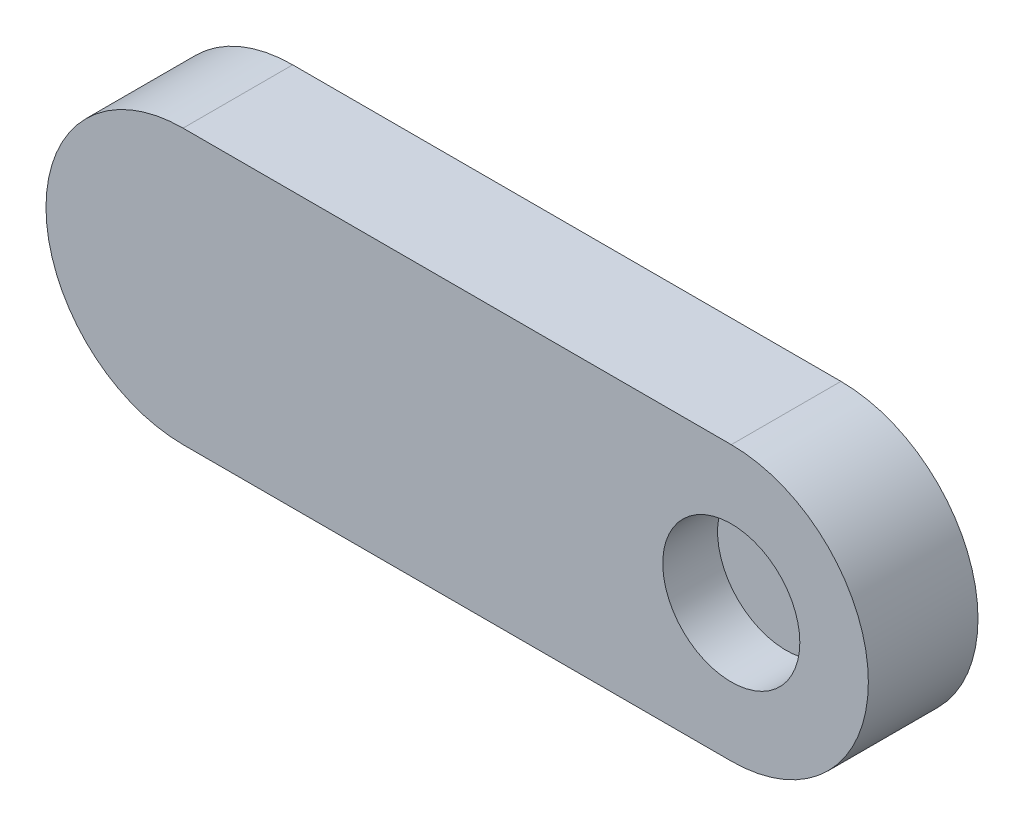
ISO-10303-21;
HEADER;
FILE_DESCRIPTION(('STEP AP214'),'2;1');
FILE_NAME('part.step','',(''),(''),'','','');
FILE_SCHEMA(('AUTOMOTIVE_DESIGN { 1 0 10303 214 1 1 1 1 }'));
ENDSEC;
DATA;
#1=APPLICATION_CONTEXT('core data for automotive mechanical design processes');
#2=APPLICATION_PROTOCOL_DEFINITION('international standard','automotive_design',2000,#1);
#3=PRODUCT_CONTEXT('',#1,'mechanical');
#4=PRODUCT('Part','Part','',(#3));
#5=PRODUCT_RELATED_PRODUCT_CATEGORY('part','',(#4));
#6=PRODUCT_DEFINITION_FORMATION('','',#4);
#7=PRODUCT_DEFINITION_CONTEXT('part definition',#1,'design');
#8=PRODUCT_DEFINITION('design','',#6,#7);
#9=PRODUCT_DEFINITION_SHAPE('','',#8);
#10=(LENGTH_UNIT() NAMED_UNIT(*) SI_UNIT(.MILLI.,.METRE.));
#11=(NAMED_UNIT(*) PLANE_ANGLE_UNIT() SI_UNIT($,.RADIAN.));
#12=(NAMED_UNIT(*) SI_UNIT($,.STERADIAN.) SOLID_ANGLE_UNIT());
#13=UNCERTAINTY_MEASURE_WITH_UNIT(LENGTH_MEASURE(1.E-05),#10,'distance_accuracy_value','');
#14=(GEOMETRIC_REPRESENTATION_CONTEXT(3) GLOBAL_UNCERTAINTY_ASSIGNED_CONTEXT((#13)) GLOBAL_UNIT_ASSIGNED_CONTEXT((#10,
#11,#12)) REPRESENTATION_CONTEXT('',''));
#15=CARTESIAN_POINT('',(0.,0.,0.));
#16=DIRECTION('',(0.,0.,1.));
#17=DIRECTION('',(1.,0.,0.));
#18=AXIS2_PLACEMENT_3D('',#15,#16,#17);
#19=CARTESIAN_POINT('',(0.,0.,40.));
#20=DIRECTION('',(0.,0.,-1.));
#21=DIRECTION('',(-1.,0.,0.));
#22=AXIS2_PLACEMENT_3D('',#19,#20,#21);
#23=CYLINDRICAL_SURFACE('',#22,50.);
#24=CARTESIAN_POINT('',(0.,0.,0.));
#25=DIRECTION('',(0.,0.,1.));
#26=DIRECTION('',(1.,0.,0.));
#27=AXIS2_PLACEMENT_3D('',#24,#25,#26);
#28=CIRCLE('',#27,50.);
#29=CARTESIAN_POINT('',(0.,50.,0.));
#30=VERTEX_POINT('',#29);
#31=CARTESIAN_POINT('',(0.,-50.,0.));
#32=VERTEX_POINT('',#31);
#33=EDGE_CURVE('E107',#30,#32,#28,.T.);
#34=ORIENTED_EDGE('',*,*,#33,.T.);
#35=DIRECTION('',(0.,0.,-1.));
#36=VECTOR('',#35,1.);
#37=CARTESIAN_POINT('',(0.,-50.,40.));
#38=LINE('',#37,#36);
#39=CARTESIAN_POINT('',(0.,-50.,40.));
#40=VERTEX_POINT('',#39);
#41=EDGE_CURVE('E11',#40,#32,#38,.T.);
#42=ORIENTED_EDGE('',*,*,#41,.F.);
#43=CARTESIAN_POINT('',(0.,0.,40.));
#44=DIRECTION('',(0.,0.,1.));
#45=DIRECTION('',(1.,0.,0.));
#46=AXIS2_PLACEMENT_3D('',#43,#44,#45);
#47=CIRCLE('',#46,50.);
#48=CARTESIAN_POINT('',(0.,50.,40.));
#49=VERTEX_POINT('',#48);
#50=EDGE_CURVE('E91',#49,#40,#47,.T.);
#51=ORIENTED_EDGE('',*,*,#50,.F.);
#52=DIRECTION('',(0.,0.,-1.));
#53=VECTOR('',#52,1.);
#54=CARTESIAN_POINT('',(0.,50.,40.));
#55=LINE('',#54,#53);
#56=EDGE_CURVE('E103',#49,#30,#55,.T.);
#57=ORIENTED_EDGE('',*,*,#56,.T.);
#58=EDGE_LOOP('',(#34,#42,#51,#57));
#59=FACE_BOUND('',#58,.T.);
#60=ADVANCED_FACE('F39',(#59),#23,.T.);
#61=CARTESIAN_POINT('',(0.,-50.,40.));
#62=DIRECTION('',(0.,1.,0.));
#63=DIRECTION('',(0.,0.,1.));
#64=AXIS2_PLACEMENT_3D('',#61,#62,#63);
#65=PLANE('',#64);
#66=DIRECTION('',(1.,0.,0.));
#67=VECTOR('',#66,1.);
#68=CARTESIAN_POINT('',(0.,-50.,0.));
#69=LINE('',#68,#67);
#70=CARTESIAN_POINT('',(200.,-50.,0.));
#71=VERTEX_POINT('',#70);
#72=EDGE_CURVE('E96',#32,#71,#69,.T.);
#73=ORIENTED_EDGE('',*,*,#72,.T.);
#74=DIRECTION('',(0.,0.,-1.));
#75=VECTOR('',#74,1.);
#76=CARTESIAN_POINT('',(200.,-50.,40.));
#77=LINE('',#76,#75);
#78=CARTESIAN_POINT('',(200.,-50.,40.));
#79=VERTEX_POINT('',#78);
#80=EDGE_CURVE('E48',#79,#71,#77,.T.);
#81=ORIENTED_EDGE('',*,*,#80,.F.);
#82=DIRECTION('',(1.,0.,0.));
#83=VECTOR('',#82,1.);
#84=CARTESIAN_POINT('',(0.,-50.,40.));
#85=LINE('',#84,#83);
#86=EDGE_CURVE('E86',#40,#79,#85,.T.);
#87=ORIENTED_EDGE('',*,*,#86,.F.);
#88=ORIENTED_EDGE('',*,*,#41,.T.);
#89=EDGE_LOOP('',(#73,#81,#87,#88));
#90=FACE_BOUND('',#89,.T.);
#91=ADVANCED_FACE('F95',(#90),#65,.F.);
#92=CARTESIAN_POINT('',(200.,0.,40.));
#93=DIRECTION('',(0.,0.,-1.));
#94=DIRECTION('',(-1.,0.,0.));
#95=AXIS2_PLACEMENT_3D('',#92,#93,#94);
#96=CYLINDRICAL_SURFACE('',#95,50.);
#97=CARTESIAN_POINT('',(200.,0.,0.));
#98=DIRECTION('',(0.,0.,1.));
#99=DIRECTION('',(1.,0.,0.));
#100=AXIS2_PLACEMENT_3D('',#97,#98,#99);
#101=CIRCLE('',#100,50.);
#102=CARTESIAN_POINT('',(200.,50.,0.));
#103=VERTEX_POINT('',#102);
#104=EDGE_CURVE('E73',#71,#103,#101,.T.);
#105=ORIENTED_EDGE('',*,*,#104,.T.);
#106=DIRECTION('',(0.,0.,-1.));
#107=VECTOR('',#106,1.);
#108=CARTESIAN_POINT('',(200.,50.,40.));
#109=LINE('',#108,#107);
#110=CARTESIAN_POINT('',(200.,50.,40.));
#111=VERTEX_POINT('',#110);
#112=EDGE_CURVE('E98',#111,#103,#109,.T.);
#113=ORIENTED_EDGE('',*,*,#112,.F.);
#114=CARTESIAN_POINT('',(200.,0.,40.));
#115=DIRECTION('',(0.,0.,1.));
#116=DIRECTION('',(1.,0.,0.));
#117=AXIS2_PLACEMENT_3D('',#114,#115,#116);
#118=CIRCLE('',#117,50.);
#119=EDGE_CURVE('E89',#79,#111,#118,.T.);
#120=ORIENTED_EDGE('',*,*,#119,.F.);
#121=ORIENTED_EDGE('',*,*,#80,.T.);
#122=EDGE_LOOP('',(#105,#113,#120,#121));
#123=FACE_BOUND('',#122,.T.);
#124=ADVANCED_FACE('F99',(#123),#96,.T.);
#125=CARTESIAN_POINT('',(0.,50.,40.));
#126=DIRECTION('',(0.,-1.,0.));
#127=DIRECTION('',(0.,0.,-1.));
#128=AXIS2_PLACEMENT_3D('',#125,#126,#127);
#129=PLANE('',#128);
#130=DIRECTION('',(-1.,0.,0.));
#131=VECTOR('',#130,1.);
#132=CARTESIAN_POINT('',(0.,50.,0.));
#133=LINE('',#132,#131);
#134=EDGE_CURVE('E79',#103,#30,#133,.T.);
#135=ORIENTED_EDGE('',*,*,#134,.T.);
#136=ORIENTED_EDGE('',*,*,#56,.F.);
#137=DIRECTION('',(-1.,0.,0.));
#138=VECTOR('',#137,1.);
#139=CARTESIAN_POINT('',(0.,50.,40.));
#140=LINE('',#139,#138);
#141=EDGE_CURVE('E56',#111,#49,#140,.T.);
#142=ORIENTED_EDGE('',*,*,#141,.F.);
#143=ORIENTED_EDGE('',*,*,#112,.T.);
#144=EDGE_LOOP('',(#135,#136,#142,#143));
#145=FACE_BOUND('',#144,.T.);
#146=ADVANCED_FACE('F121',(#145),#129,.F.);
#147=CARTESIAN_POINT('',(0.,0.,40.));
#148=DIRECTION('',(0.,0.,1.));
#149=DIRECTION('',(1.,0.,0.));
#150=AXIS2_PLACEMENT_3D('',#147,#148,#149);
#151=PLANE('',#150);
#152=CARTESIAN_POINT('',(200.,0.,40.));
#153=DIRECTION('',(0.,0.,1.));
#154=DIRECTION('',(1.,0.,0.));
#155=AXIS2_PLACEMENT_3D('',#152,#153,#154);
#156=CIRCLE('',#155,25.);
#157=CARTESIAN_POINT('',(225.,0.,40.));
#158=VERTEX_POINT('',#157);
#159=EDGE_CURVE('E136',#158,#158,#156,.T.);
#160=ORIENTED_EDGE('',*,*,#159,.F.);
#161=EDGE_LOOP('',(#160));
#162=FACE_BOUND('',#161,.T.);
#163=ORIENTED_EDGE('',*,*,#50,.T.);
#164=ORIENTED_EDGE('',*,*,#86,.T.);
#165=ORIENTED_EDGE('',*,*,#119,.T.);
#166=ORIENTED_EDGE('',*,*,#141,.T.);
#167=EDGE_LOOP('',(#163,#164,#165,#166));
#168=FACE_BOUND('',#167,.T.);
#169=ADVANCED_FACE('F87',(#162,#168),#151,.T.);
#170=CARTESIAN_POINT('',(0.,0.,0.));
#171=DIRECTION('',(0.,0.,1.));
#172=DIRECTION('',(1.,0.,0.));
#173=AXIS2_PLACEMENT_3D('',#170,#171,#172);
#174=PLANE('',#173);
#175=CARTESIAN_POINT('',(0.,0.,0.));
#176=DIRECTION('',(0.,0.,-1.));
#177=DIRECTION('',(-1.,0.,0.));
#178=AXIS2_PLACEMENT_3D('',#175,#176,#177);
#179=CIRCLE('',#178,25.);
#180=CARTESIAN_POINT('',(-25.,0.,0.));
#181=VERTEX_POINT('',#180);
#182=EDGE_CURVE('E128',#181,#181,#179,.T.);
#183=ORIENTED_EDGE('',*,*,#182,.F.);
#184=EDGE_LOOP('',(#183));
#185=FACE_BOUND('',#184,.T.);
#186=ORIENTED_EDGE('',*,*,#33,.F.);
#187=ORIENTED_EDGE('',*,*,#134,.F.);
#188=ORIENTED_EDGE('',*,*,#104,.F.);
#189=ORIENTED_EDGE('',*,*,#72,.F.);
#190=EDGE_LOOP('',(#186,#187,#188,#189));
#191=FACE_BOUND('',#190,.T.);
#192=ADVANCED_FACE('F124',(#185,#191),#174,.F.);
#193=CARTESIAN_POINT('',(0.,0.,20.));
#194=DIRECTION('',(0.,0.,-1.));
#195=DIRECTION('',(-1.,0.,0.));
#196=AXIS2_PLACEMENT_3D('',#193,#194,#195);
#197=CYLINDRICAL_SURFACE('',#196,25.);
#198=CARTESIAN_POINT('',(0.,0.,20.));
#199=DIRECTION('',(0.,0.,-1.));
#200=DIRECTION('',(-1.,0.,0.));
#201=AXIS2_PLACEMENT_3D('',#198,#199,#200);
#202=CIRCLE('',#201,25.);
#203=CARTESIAN_POINT('',(-25.,0.,20.));
#204=VERTEX_POINT('',#203);
#205=EDGE_CURVE('E111',#204,#204,#202,.T.);
#206=ORIENTED_EDGE('',*,*,#205,.F.);
#207=EDGE_LOOP('',(#206));
#208=FACE_BOUND('',#207,.T.);
#209=ORIENTED_EDGE('',*,*,#182,.T.);
#210=EDGE_LOOP('',(#209));
#211=FACE_BOUND('',#210,.T.);
#212=ADVANCED_FACE('F159',(#208,#211),#197,.F.);
#213=CARTESIAN_POINT('',(0.,0.,20.));
#214=DIRECTION('',(0.,0.,-1.));
#215=DIRECTION('',(-1.,0.,0.));
#216=AXIS2_PLACEMENT_3D('',#213,#214,#215);
#217=PLANE('',#216);
#218=ORIENTED_EDGE('',*,*,#205,.T.);
#219=EDGE_LOOP('',(#218));
#220=FACE_BOUND('',#219,.T.);
#221=ADVANCED_FACE('F149',(#220),#217,.T.);
#222=CARTESIAN_POINT('',(200.,0.,20.));
#223=DIRECTION('',(0.,0.,1.));
#224=DIRECTION('',(1.,0.,0.));
#225=AXIS2_PLACEMENT_3D('',#222,#223,#224);
#226=CYLINDRICAL_SURFACE('',#225,25.);
#227=CARTESIAN_POINT('',(200.,0.,20.));
#228=DIRECTION('',(0.,0.,1.));
#229=DIRECTION('',(1.,0.,0.));
#230=AXIS2_PLACEMENT_3D('',#227,#228,#229);
#231=CIRCLE('',#230,25.);
#232=CARTESIAN_POINT('',(225.,0.,20.));
#233=VERTEX_POINT('',#232);
#234=EDGE_CURVE('E132',#233,#233,#231,.T.);
#235=ORIENTED_EDGE('',*,*,#234,.F.);
#236=EDGE_LOOP('',(#235));
#237=FACE_BOUND('',#236,.T.);
#238=ORIENTED_EDGE('',*,*,#159,.T.);
#239=EDGE_LOOP('',(#238));
#240=FACE_BOUND('',#239,.T.);
#241=ADVANCED_FACE('F146',(#237,#240),#226,.F.);
#242=CARTESIAN_POINT('',(200.,0.,20.));
#243=DIRECTION('',(0.,0.,1.));
#244=DIRECTION('',(1.,0.,0.));
#245=AXIS2_PLACEMENT_3D('',#242,#243,#244);
#246=PLANE('',#245);
#247=ORIENTED_EDGE('',*,*,#234,.T.);
#248=EDGE_LOOP('',(#247));
#249=FACE_BOUND('',#248,.T.);
#250=ADVANCED_FACE('F144',(#249),#246,.T.);
#251=CLOSED_SHELL('',(#60,#91,#124,#146,#169,#192,#212,#221,#241,#250));
#252=MANIFOLD_SOLID_BREP('B2',#251);
#253=ADVANCED_BREP_SHAPE_REPRESENTATION('',(#18,#252),#14);
#254=SHAPE_DEFINITION_REPRESENTATION(#9,#253);
ENDSEC;
END-ISO-10303-21;
